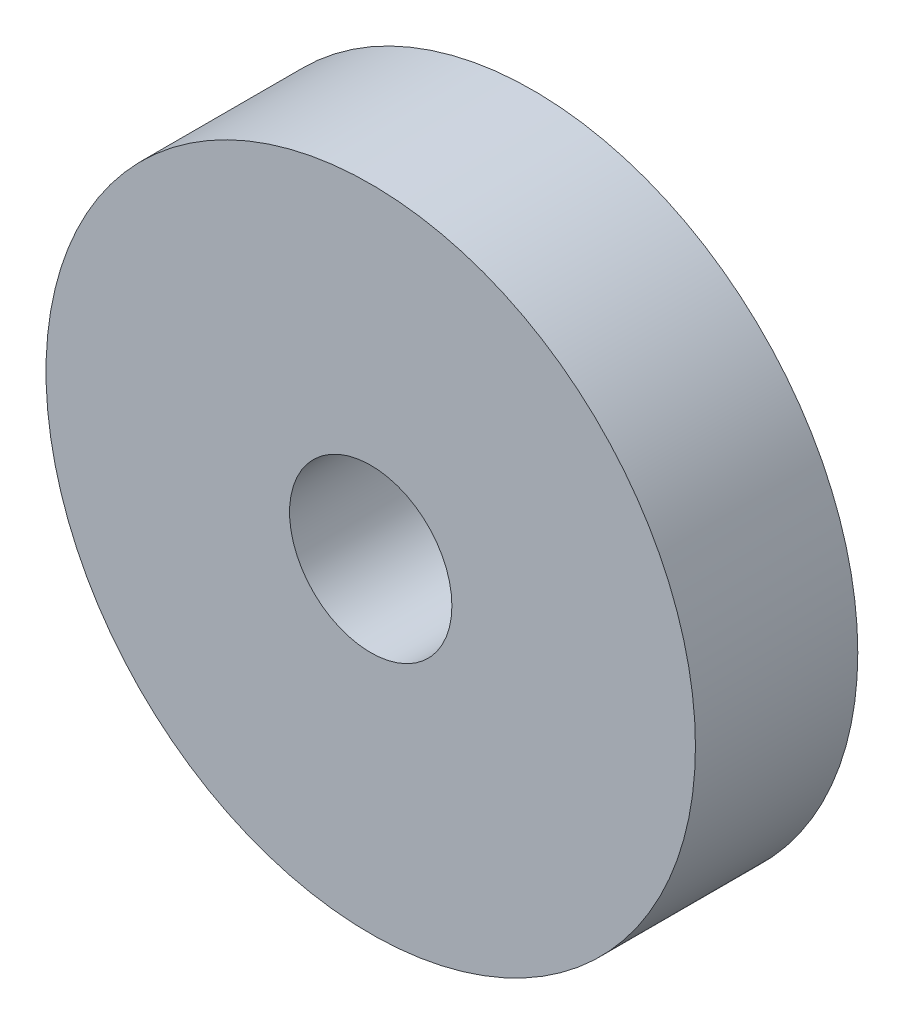
ISO-10303-21;
HEADER;
FILE_DESCRIPTION(('STEP AP214'),'2;1');
FILE_NAME('part.step','',(''),(''),'','','');
FILE_SCHEMA(('AUTOMOTIVE_DESIGN { 1 0 10303 214 1 1 1 1 }'));
ENDSEC;
DATA;
#1=APPLICATION_CONTEXT('core data for automotive mechanical design processes');
#2=APPLICATION_PROTOCOL_DEFINITION('international standard','automotive_design',2000,#1);
#3=PRODUCT_CONTEXT('',#1,'mechanical');
#4=PRODUCT('Part','Part','',(#3));
#5=PRODUCT_RELATED_PRODUCT_CATEGORY('part','',(#4));
#6=PRODUCT_DEFINITION_FORMATION('','',#4);
#7=PRODUCT_DEFINITION_CONTEXT('part definition',#1,'design');
#8=PRODUCT_DEFINITION('design','',#6,#7);
#9=PRODUCT_DEFINITION_SHAPE('','',#8);
#10=(LENGTH_UNIT() NAMED_UNIT(*) SI_UNIT(.MILLI.,.METRE.));
#11=(NAMED_UNIT(*) PLANE_ANGLE_UNIT() SI_UNIT($,.RADIAN.));
#12=(NAMED_UNIT(*) SI_UNIT($,.STERADIAN.) SOLID_ANGLE_UNIT());
#13=UNCERTAINTY_MEASURE_WITH_UNIT(LENGTH_MEASURE(1.E-05),#10,'distance_accuracy_value','');
#14=(GEOMETRIC_REPRESENTATION_CONTEXT(3) GLOBAL_UNCERTAINTY_ASSIGNED_CONTEXT((#13)) GLOBAL_UNIT_ASSIGNED_CONTEXT((#10,
#11,#12)) REPRESENTATION_CONTEXT('',''));
#15=CARTESIAN_POINT('',(0.,0.,0.));
#16=DIRECTION('',(0.,0.,1.));
#17=DIRECTION('',(1.,0.,0.));
#18=AXIS2_PLACEMENT_3D('',#15,#16,#17);
#19=CARTESIAN_POINT('',(0.,0.,10.));
#20=DIRECTION('',(0.,0.,1.));
#21=DIRECTION('',(1.,0.,0.));
#22=AXIS2_PLACEMENT_3D('',#19,#20,#21);
#23=PLANE('',#22);
#24=CARTESIAN_POINT('',(0.,0.,10.));
#25=DIRECTION('',(0.,0.,1.));
#26=DIRECTION('',(1.,0.,0.));
#27=AXIS2_PLACEMENT_3D('',#24,#25,#26);
#28=CIRCLE('',#27,20.);
#29=CARTESIAN_POINT('',(20.,0.,10.));
#30=VERTEX_POINT('',#29);
#31=EDGE_CURVE('E10',#30,#30,#28,.T.);
#32=ORIENTED_EDGE('',*,*,#31,.T.);
#33=EDGE_LOOP('',(#32));
#34=FACE_BOUND('',#33,.T.);
#35=CARTESIAN_POINT('',(0.,0.,10.));
#36=DIRECTION('',(0.,0.,1.));
#37=DIRECTION('',(1.,0.,0.));
#38=AXIS2_PLACEMENT_3D('',#35,#36,#37);
#39=CIRCLE('',#38,5.);
#40=CARTESIAN_POINT('',(5.,0.,10.));
#41=VERTEX_POINT('',#40);
#42=EDGE_CURVE('E42',#41,#41,#39,.T.);
#43=ORIENTED_EDGE('',*,*,#42,.F.);
#44=EDGE_LOOP('',(#43));
#45=FACE_BOUND('',#44,.T.);
#46=ADVANCED_FACE('F31',(#34,#45),#23,.T.);
#47=CARTESIAN_POINT('',(0.,0.,0.));
#48=DIRECTION('',(0.,0.,1.));
#49=DIRECTION('',(1.,0.,0.));
#50=AXIS2_PLACEMENT_3D('',#47,#48,#49);
#51=PLANE('',#50);
#52=CARTESIAN_POINT('',(0.,0.,0.));
#53=DIRECTION('',(0.,0.,1.));
#54=DIRECTION('',(1.,0.,0.));
#55=AXIS2_PLACEMENT_3D('',#52,#53,#54);
#56=CIRCLE('',#55,20.);
#57=CARTESIAN_POINT('',(20.,0.,0.));
#58=VERTEX_POINT('',#57);
#59=EDGE_CURVE('E35',#58,#58,#56,.T.);
#60=ORIENTED_EDGE('',*,*,#59,.F.);
#61=EDGE_LOOP('',(#60));
#62=FACE_BOUND('',#61,.T.);
#63=CARTESIAN_POINT('',(0.,0.,0.));
#64=DIRECTION('',(0.,0.,1.));
#65=DIRECTION('',(1.,0.,0.));
#66=AXIS2_PLACEMENT_3D('',#63,#64,#65);
#67=CIRCLE('',#66,5.);
#68=CARTESIAN_POINT('',(5.,0.,0.));
#69=VERTEX_POINT('',#68);
#70=EDGE_CURVE('E44',#69,#69,#67,.T.);
#71=ORIENTED_EDGE('',*,*,#70,.T.);
#72=EDGE_LOOP('',(#71));
#73=FACE_BOUND('',#72,.T.);
#74=ADVANCED_FACE('F54',(#62,#73),#51,.F.);
#75=CARTESIAN_POINT('',(0.,0.,10.));
#76=DIRECTION('',(0.,0.,-1.));
#77=DIRECTION('',(-1.,0.,0.));
#78=AXIS2_PLACEMENT_3D('',#75,#76,#77);
#79=CYLINDRICAL_SURFACE('',#78,20.);
#80=ORIENTED_EDGE('',*,*,#31,.F.);
#81=EDGE_LOOP('',(#80));
#82=FACE_BOUND('',#81,.T.);
#83=ORIENTED_EDGE('',*,*,#59,.T.);
#84=EDGE_LOOP('',(#83));
#85=FACE_BOUND('',#84,.T.);
#86=ADVANCED_FACE('F33',(#82,#85),#79,.T.);
#87=CARTESIAN_POINT('',(0.,0.,10.));
#88=DIRECTION('',(0.,0.,-1.));
#89=DIRECTION('',(-1.,0.,0.));
#90=AXIS2_PLACEMENT_3D('',#87,#88,#89);
#91=CYLINDRICAL_SURFACE('',#90,5.);
#92=ORIENTED_EDGE('',*,*,#42,.T.);
#93=EDGE_LOOP('',(#92));
#94=FACE_BOUND('',#93,.T.);
#95=ORIENTED_EDGE('',*,*,#70,.F.);
#96=EDGE_LOOP('',(#95));
#97=FACE_BOUND('',#96,.T.);
#98=ADVANCED_FACE('F50',(#94,#97),#91,.F.);
#99=CLOSED_SHELL('',(#46,#74,#86,#98));
#100=MANIFOLD_SOLID_BREP('B2',#99);
#101=ADVANCED_BREP_SHAPE_REPRESENTATION('',(#18,#100),#14);
#102=SHAPE_DEFINITION_REPRESENTATION(#9,#101);
ENDSEC;
END-ISO-10303-21;
